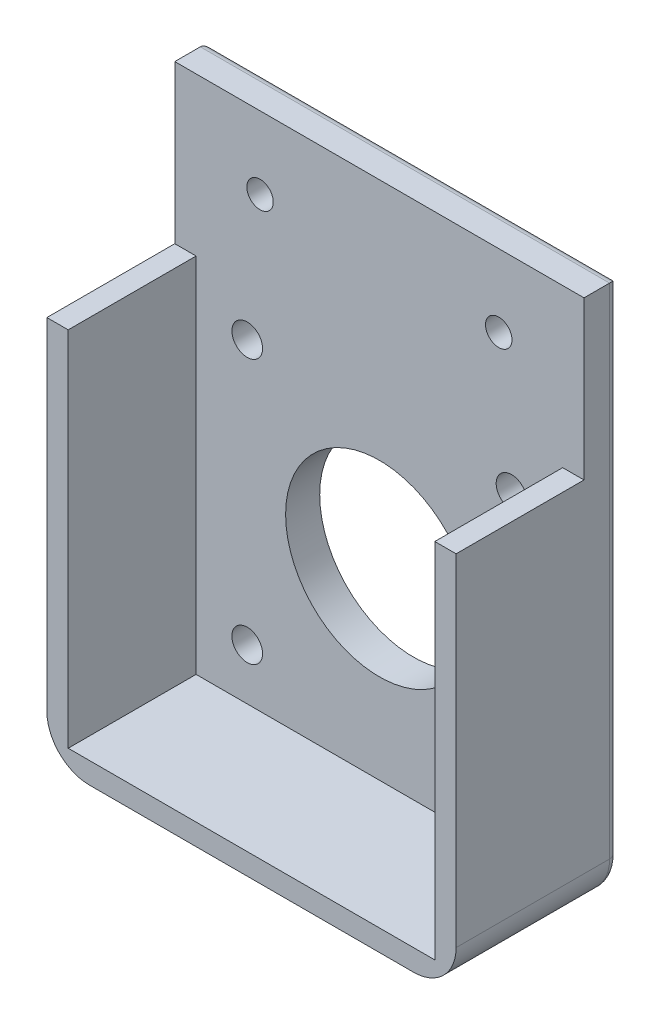
ISO-10303-21;
HEADER;
FILE_DESCRIPTION(('STEP AP214'),'2;1');
FILE_NAME('part.step','',(''),(''),'','','');
FILE_SCHEMA(('AUTOMOTIVE_DESIGN { 1 0 10303 214 1 1 1 1 }'));
ENDSEC;
DATA;
#1=APPLICATION_CONTEXT('core data for automotive mechanical design processes');
#2=APPLICATION_PROTOCOL_DEFINITION('international standard','automotive_design',2000,#1);
#3=PRODUCT_CONTEXT('',#1,'mechanical');
#4=PRODUCT('Part','Part','',(#3));
#5=PRODUCT_RELATED_PRODUCT_CATEGORY('part','',(#4));
#6=PRODUCT_DEFINITION_FORMATION('','',#4);
#7=PRODUCT_DEFINITION_CONTEXT('part definition',#1,'design');
#8=PRODUCT_DEFINITION('design','',#6,#7);
#9=PRODUCT_DEFINITION_SHAPE('','',#8);
#10=(LENGTH_UNIT() NAMED_UNIT(*) SI_UNIT(.MILLI.,.METRE.));
#11=(NAMED_UNIT(*) PLANE_ANGLE_UNIT() SI_UNIT($,.RADIAN.));
#12=(NAMED_UNIT(*) SI_UNIT($,.STERADIAN.) SOLID_ANGLE_UNIT());
#13=UNCERTAINTY_MEASURE_WITH_UNIT(LENGTH_MEASURE(1.E-05),#10,'distance_accuracy_value','');
#14=(GEOMETRIC_REPRESENTATION_CONTEXT(3) GLOBAL_UNCERTAINTY_ASSIGNED_CONTEXT((#13)) GLOBAL_UNIT_ASSIGNED_CONTEXT((#10,
#11,#12)) REPRESENTATION_CONTEXT('',''));
#15=CARTESIAN_POINT('',(0.,0.,0.));
#16=DIRECTION('',(0.,0.,1.));
#17=DIRECTION('',(1.,0.,0.));
#18=AXIS2_PLACEMENT_3D('',#15,#16,#17);
#19=CARTESIAN_POINT('',(0.,0.,0.));
#20=DIRECTION('',(0.,0.,1.));
#21=DIRECTION('',(1.,0.,0.));
#22=AXIS2_PLACEMENT_3D('',#19,#20,#21);
#23=PLANE('',#22);
#24=CARTESIAN_POINT('',(-4.35440613026818,60.4741379310345,0.));
#25=DIRECTION('',(0.,0.,1.));
#26=DIRECTION('',(1.,0.,0.));
#27=AXIS2_PLACEMENT_3D('',#24,#25,#26);
#28=CIRCLE('',#27,1.54999999999999);
#29=CARTESIAN_POINT('',(-2.80440613026819,60.4741379310345,0.));
#30=VERTEX_POINT('',#29);
#31=EDGE_CURVE('E221',#30,#30,#28,.T.);
#32=ORIENTED_EDGE('',*,*,#31,.T.);
#33=EDGE_LOOP('',(#32));
#34=FACE_BOUND('',#33,.T.);
#35=CARTESIAN_POINT('',(23.6455938697318,60.4741379310345,0.));
#36=DIRECTION('',(0.,0.,1.));
#37=DIRECTION('',(1.,0.,0.));
#38=AXIS2_PLACEMENT_3D('',#35,#36,#37);
#39=CIRCLE('',#38,1.54999999999999);
#40=CARTESIAN_POINT('',(25.1955938697318,60.4741379310345,0.));
#41=VERTEX_POINT('',#40);
#42=EDGE_CURVE('E227',#41,#41,#39,.T.);
#43=ORIENTED_EDGE('',*,*,#42,.T.);
#44=EDGE_LOOP('',(#43));
#45=FACE_BOUND('',#44,.T.);
#46=CARTESIAN_POINT('',(25.1455938697318,13.9741379310345,0.));
#47=DIRECTION('',(0.,0.,1.));
#48=DIRECTION('',(1.,0.,0.));
#49=AXIS2_PLACEMENT_3D('',#46,#47,#48);
#50=CIRCLE('',#49,1.8);
#51=CARTESIAN_POINT('',(26.9455938697318,13.9741379310345,0.));
#52=VERTEX_POINT('',#51);
#53=EDGE_CURVE('E233',#52,#52,#50,.T.);
#54=ORIENTED_EDGE('',*,*,#53,.T.);
#55=EDGE_LOOP('',(#54));
#56=FACE_BOUND('',#55,.T.);
#57=CARTESIAN_POINT('',(-5.85440613026818,13.9741379310345,0.));
#58=DIRECTION('',(0.,0.,1.));
#59=DIRECTION('',(1.,0.,0.));
#60=AXIS2_PLACEMENT_3D('',#57,#58,#59);
#61=CIRCLE('',#60,1.8);
#62=CARTESIAN_POINT('',(-4.05440613026818,13.9741379310345,0.));
#63=VERTEX_POINT('',#62);
#64=EDGE_CURVE('E239',#63,#63,#61,.T.);
#65=ORIENTED_EDGE('',*,*,#64,.T.);
#66=EDGE_LOOP('',(#65));
#67=FACE_BOUND('',#66,.T.);
#68=CARTESIAN_POINT('',(25.1455938697318,44.9741379310345,0.));
#69=DIRECTION('',(0.,0.,1.));
#70=DIRECTION('',(1.,0.,0.));
#71=AXIS2_PLACEMENT_3D('',#68,#69,#70);
#72=CIRCLE('',#71,1.8);
#73=CARTESIAN_POINT('',(26.9455938697318,44.9741379310345,0.));
#74=VERTEX_POINT('',#73);
#75=EDGE_CURVE('E242',#74,#74,#72,.T.);
#76=ORIENTED_EDGE('',*,*,#75,.T.);
#77=EDGE_LOOP('',(#76));
#78=FACE_BOUND('',#77,.T.);
#79=CARTESIAN_POINT('',(-5.85440613026818,44.9741379310345,0.));
#80=DIRECTION('',(0.,0.,1.));
#81=DIRECTION('',(1.,0.,0.));
#82=AXIS2_PLACEMENT_3D('',#79,#80,#81);
#83=CIRCLE('',#82,1.8);
#84=CARTESIAN_POINT('',(-4.05440613026818,44.9741379310345,0.));
#85=VERTEX_POINT('',#84);
#86=EDGE_CURVE('E251',#85,#85,#83,.T.);
#87=ORIENTED_EDGE('',*,*,#86,.T.);
#88=EDGE_LOOP('',(#87));
#89=FACE_BOUND('',#88,.T.);
#90=CARTESIAN_POINT('',(9.64559386973182,29.4741379310345,0.));
#91=DIRECTION('',(0.,0.,1.));
#92=DIRECTION('',(1.,0.,0.));
#93=AXIS2_PLACEMENT_3D('',#90,#91,#92);
#94=CIRCLE('',#93,11.);
#95=CARTESIAN_POINT('',(20.6455938697318,29.4741379310345,0.));
#96=VERTEX_POINT('',#95);
#97=EDGE_CURVE('E257',#96,#96,#94,.T.);
#98=ORIENTED_EDGE('',*,*,#97,.T.);
#99=EDGE_LOOP('',(#98));
#100=FACE_BOUND('',#99,.T.);
#101=CARTESIAN_POINT('',(-9.35440613026818,10.4741379310345,0.));
#102=DIRECTION('',(0.,0.,1.));
#103=DIRECTION('',(1.,0.,0.));
#104=AXIS2_PLACEMENT_3D('',#101,#102,#103);
#105=CIRCLE('',#104,4.);
#106=CARTESIAN_POINT('',(-13.3544061302682,10.4741379310345,0.));
#107=VERTEX_POINT('',#106);
#108=CARTESIAN_POINT('',(-9.35440613026818,6.47413793103448,0.));
#109=VERTEX_POINT('',#108);
#110=EDGE_CURVE('E297',#107,#109,#105,.T.);
#111=ORIENTED_EDGE('',*,*,#110,.F.);
#112=DIRECTION('',(0.,-1.,0.));
#113=VECTOR('',#112,1.);
#114=CARTESIAN_POINT('',(-13.3544061302682,0.,0.));
#115=LINE('',#114,#113);
#116=CARTESIAN_POINT('',(-13.3544061302682,67.9741379310345,0.));
#117=VERTEX_POINT('',#116);
#118=EDGE_CURVE('E280',#107,#117,#115,.F.);
#119=ORIENTED_EDGE('',*,*,#118,.T.);
#120=DIRECTION('',(-1.,0.,0.));
#121=VECTOR('',#120,1.);
#122=CARTESIAN_POINT('',(0.,67.9741379310345,0.));
#123=LINE('',#122,#121);
#124=CARTESIAN_POINT('',(32.6455938697318,67.9741379310345,0.));
#125=VERTEX_POINT('',#124);
#126=EDGE_CURVE('E275',#117,#125,#123,.F.);
#127=ORIENTED_EDGE('',*,*,#126,.T.);
#128=DIRECTION('',(0.,1.,0.));
#129=VECTOR('',#128,1.);
#130=CARTESIAN_POINT('',(32.6455938697318,0.,0.));
#131=LINE('',#130,#129);
#132=CARTESIAN_POINT('',(32.6455938697318,10.4741379310345,0.));
#133=VERTEX_POINT('',#132);
#134=EDGE_CURVE('E277',#125,#133,#131,.F.);
#135=ORIENTED_EDGE('',*,*,#134,.T.);
#136=CARTESIAN_POINT('',(28.6455938697318,10.4741379310345,0.));
#137=DIRECTION('',(0.,0.,1.));
#138=DIRECTION('',(1.,0.,0.));
#139=AXIS2_PLACEMENT_3D('',#136,#137,#138);
#140=CIRCLE('',#139,4.);
#141=CARTESIAN_POINT('',(28.6455938697318,6.47413793103448,0.));
#142=VERTEX_POINT('',#141);
#143=EDGE_CURVE('E291',#142,#133,#140,.T.);
#144=ORIENTED_EDGE('',*,*,#143,.F.);
#145=DIRECTION('',(1.,0.,0.));
#146=VECTOR('',#145,1.);
#147=CARTESIAN_POINT('',(0.,6.47413793103448,0.));
#148=LINE('',#147,#146);
#149=EDGE_CURVE('E282',#142,#109,#148,.F.);
#150=ORIENTED_EDGE('',*,*,#149,.T.);
#151=EDGE_LOOP('',(#111,#119,#127,#135,#144,#150));
#152=FACE_BOUND('',#151,.T.);
#153=ADVANCED_FACE('F43',(#34,#45,#56,#67,#78,#89,#100,#152),#23,.F.);
#154=CARTESIAN_POINT('',(0.,0.,4.));
#155=DIRECTION('',(0.,0.,1.));
#156=DIRECTION('',(1.,0.,0.));
#157=AXIS2_PLACEMENT_3D('',#154,#155,#156);
#158=PLANE('',#157);
#159=CARTESIAN_POINT('',(-4.35440613026818,60.4741379310345,4.));
#160=DIRECTION('',(0.,0.,1.));
#161=DIRECTION('',(1.,0.,0.));
#162=AXIS2_PLACEMENT_3D('',#159,#160,#161);
#163=CIRCLE('',#162,1.54999999999999);
#164=CARTESIAN_POINT('',(-2.80440613026819,60.4741379310345,4.));
#165=VERTEX_POINT('',#164);
#166=EDGE_CURVE('E173',#165,#165,#163,.T.);
#167=ORIENTED_EDGE('',*,*,#166,.F.);
#168=EDGE_LOOP('',(#167));
#169=FACE_BOUND('',#168,.T.);
#170=CARTESIAN_POINT('',(23.6455938697318,60.4741379310345,4.));
#171=DIRECTION('',(0.,0.,1.));
#172=DIRECTION('',(1.,0.,0.));
#173=AXIS2_PLACEMENT_3D('',#170,#171,#172);
#174=CIRCLE('',#173,1.54999999999999);
#175=CARTESIAN_POINT('',(25.1955938697318,60.4741379310345,4.));
#176=VERTEX_POINT('',#175);
#177=EDGE_CURVE('E224',#176,#176,#174,.T.);
#178=ORIENTED_EDGE('',*,*,#177,.F.);
#179=EDGE_LOOP('',(#178));
#180=FACE_BOUND('',#179,.T.);
#181=CARTESIAN_POINT('',(25.1455938697318,13.9741379310345,4.));
#182=DIRECTION('',(0.,0.,1.));
#183=DIRECTION('',(1.,0.,0.));
#184=AXIS2_PLACEMENT_3D('',#181,#182,#183);
#185=CIRCLE('',#184,1.8);
#186=CARTESIAN_POINT('',(26.9455938697318,13.9741379310345,4.));
#187=VERTEX_POINT('',#186);
#188=EDGE_CURVE('E230',#187,#187,#185,.T.);
#189=ORIENTED_EDGE('',*,*,#188,.F.);
#190=EDGE_LOOP('',(#189));
#191=FACE_BOUND('',#190,.T.);
#192=CARTESIAN_POINT('',(-5.85440613026818,13.9741379310345,4.));
#193=DIRECTION('',(0.,0.,1.));
#194=DIRECTION('',(1.,0.,0.));
#195=AXIS2_PLACEMENT_3D('',#192,#193,#194);
#196=CIRCLE('',#195,1.8);
#197=CARTESIAN_POINT('',(-4.05440613026818,13.9741379310345,4.));
#198=VERTEX_POINT('',#197);
#199=EDGE_CURVE('E236',#198,#198,#196,.T.);
#200=ORIENTED_EDGE('',*,*,#199,.F.);
#201=EDGE_LOOP('',(#200));
#202=FACE_BOUND('',#201,.T.);
#203=CARTESIAN_POINT('',(25.1455938697318,44.9741379310345,4.));
#204=DIRECTION('',(0.,0.,1.));
#205=DIRECTION('',(1.,0.,0.));
#206=AXIS2_PLACEMENT_3D('',#203,#204,#205);
#207=CIRCLE('',#206,1.8);
#208=CARTESIAN_POINT('',(26.9455938697318,44.9741379310345,4.));
#209=VERTEX_POINT('',#208);
#210=EDGE_CURVE('E245',#209,#209,#207,.T.);
#211=ORIENTED_EDGE('',*,*,#210,.F.);
#212=EDGE_LOOP('',(#211));
#213=FACE_BOUND('',#212,.T.);
#214=CARTESIAN_POINT('',(-5.85440613026818,44.9741379310345,4.));
#215=DIRECTION('',(0.,0.,1.));
#216=DIRECTION('',(1.,0.,0.));
#217=AXIS2_PLACEMENT_3D('',#214,#215,#216);
#218=CIRCLE('',#217,1.8);
#219=CARTESIAN_POINT('',(-4.05440613026818,44.9741379310345,4.));
#220=VERTEX_POINT('',#219);
#221=EDGE_CURVE('E248',#220,#220,#218,.T.);
#222=ORIENTED_EDGE('',*,*,#221,.F.);
#223=EDGE_LOOP('',(#222));
#224=FACE_BOUND('',#223,.T.);
#225=CARTESIAN_POINT('',(9.64559386973182,29.4741379310345,4.));
#226=DIRECTION('',(0.,0.,1.));
#227=DIRECTION('',(1.,0.,0.));
#228=AXIS2_PLACEMENT_3D('',#225,#226,#227);
#229=CIRCLE('',#228,11.);
#230=CARTESIAN_POINT('',(20.6455938697318,29.4741379310345,4.));
#231=VERTEX_POINT('',#230);
#232=EDGE_CURVE('E254',#231,#231,#229,.T.);
#233=ORIENTED_EDGE('',*,*,#232,.F.);
#234=EDGE_LOOP('',(#233));
#235=FACE_BOUND('',#234,.T.);
#236=DIRECTION('',(0.,-1.,0.));
#237=VECTOR('',#236,1.);
#238=CARTESIAN_POINT('',(-14.3544061302682,68.9741379310345,4.));
#239=LINE('',#238,#237);
#240=CARTESIAN_POINT('',(-14.3544061302682,68.9741379310345,4.));
#241=VERTEX_POINT('',#240);
#242=CARTESIAN_POINT('',(-14.3544061302682,50.4741379310345,4.));
#243=VERTEX_POINT('',#242);
#244=EDGE_CURVE('E261',#241,#243,#239,.T.);
#245=ORIENTED_EDGE('',*,*,#244,.T.);
#246=DIRECTION('',(1.,0.,0.));
#247=VECTOR('',#246,1.);
#248=CARTESIAN_POINT('',(0.,50.4741379310345,4.));
#249=LINE('',#248,#247);
#250=CARTESIAN_POINT('',(-11.8544061302682,50.4741379310345,4.));
#251=VERTEX_POINT('',#250);
#252=EDGE_CURVE('E205',#243,#251,#249,.T.);
#253=ORIENTED_EDGE('',*,*,#252,.T.);
#254=DIRECTION('',(0.,1.,0.));
#255=VECTOR('',#254,1.);
#256=CARTESIAN_POINT('',(-11.8544061302682,0.,4.));
#257=LINE('',#256,#255);
#258=CARTESIAN_POINT('',(-11.8544061302682,7.97413793103447,4.));
#259=VERTEX_POINT('',#258);
#260=EDGE_CURVE('E202',#259,#251,#257,.T.);
#261=ORIENTED_EDGE('',*,*,#260,.F.);
#262=DIRECTION('',(1.,0.,0.));
#263=VECTOR('',#262,1.);
#264=CARTESIAN_POINT('',(0.,7.97413793103447,4.));
#265=LINE('',#264,#263);
#266=CARTESIAN_POINT('',(31.1455938697318,7.97413793103447,4.));
#267=VERTEX_POINT('',#266);
#268=EDGE_CURVE('E200',#259,#267,#265,.T.);
#269=ORIENTED_EDGE('',*,*,#268,.T.);
#270=DIRECTION('',(0.,1.,0.));
#271=VECTOR('',#270,1.);
#272=CARTESIAN_POINT('',(31.1455938697318,0.,4.));
#273=LINE('',#272,#271);
#274=CARTESIAN_POINT('',(31.1455938697318,50.4741379310345,4.));
#275=VERTEX_POINT('',#274);
#276=EDGE_CURVE('E197',#267,#275,#273,.T.);
#277=ORIENTED_EDGE('',*,*,#276,.T.);
#278=DIRECTION('',(-1.,0.,0.));
#279=VECTOR('',#278,1.);
#280=CARTESIAN_POINT('',(0.,50.4741379310345,4.));
#281=LINE('',#280,#279);
#282=CARTESIAN_POINT('',(33.6455938697318,50.4741379310345,4.));
#283=VERTEX_POINT('',#282);
#284=EDGE_CURVE('E195',#283,#275,#281,.T.);
#285=ORIENTED_EDGE('',*,*,#284,.F.);
#286=DIRECTION('',(0.,1.,0.));
#287=VECTOR('',#286,1.);
#288=CARTESIAN_POINT('',(33.6455938697318,68.9741379310345,4.));
#289=LINE('',#288,#287);
#290=CARTESIAN_POINT('',(33.6455938697318,68.9741379310345,4.));
#291=VERTEX_POINT('',#290);
#292=EDGE_CURVE('E170',#283,#291,#289,.T.);
#293=ORIENTED_EDGE('',*,*,#292,.T.);
#294=DIRECTION('',(-1.,0.,0.));
#295=VECTOR('',#294,1.);
#296=CARTESIAN_POINT('',(-14.3544061302682,68.9741379310345,4.));
#297=LINE('',#296,#295);
#298=EDGE_CURVE('E265',#291,#241,#297,.T.);
#299=ORIENTED_EDGE('',*,*,#298,.T.);
#300=EDGE_LOOP('',(#245,#253,#261,#269,#277,#285,#293,#299));
#301=FACE_BOUND('',#300,.T.);
#302=ADVANCED_FACE('F346',(#169,#180,#191,#202,#213,#224,#235,#301),#158,.T.);
#303=CARTESIAN_POINT('',(-14.3544061302682,68.9741379310345,4.));
#304=DIRECTION('',(1.,0.,0.));
#305=DIRECTION('',(0.,0.,-1.));
#306=AXIS2_PLACEMENT_3D('',#303,#304,#305);
#307=PLANE('',#306);
#308=DIRECTION('',(0.,-1.,0.));
#309=VECTOR('',#308,1.);
#310=CARTESIAN_POINT('',(-14.3544061302682,68.9741379310345,1.));
#311=LINE('',#310,#309);
#312=CARTESIAN_POINT('',(-14.3544061302682,68.9741379310345,1.));
#313=VERTEX_POINT('',#312);
#314=CARTESIAN_POINT('',(-14.3544061302682,10.4741379310345,1.));
#315=VERTEX_POINT('',#314);
#316=EDGE_CURVE('E285',#313,#315,#311,.T.);
#317=ORIENTED_EDGE('',*,*,#316,.T.);
#318=DIRECTION('',(0.,0.,-1.));
#319=VECTOR('',#318,1.);
#320=CARTESIAN_POINT('',(-14.3544061302682,10.4741379310345,4.));
#321=LINE('',#320,#319);
#322=CARTESIAN_POINT('',(-14.3544061302682,10.4741379310345,19.));
#323=VERTEX_POINT('',#322);
#324=EDGE_CURVE('E11',#315,#323,#321,.F.);
#325=ORIENTED_EDGE('',*,*,#324,.T.);
#326=DIRECTION('',(0.,-1.,0.));
#327=VECTOR('',#326,1.);
#328=CARTESIAN_POINT('',(-14.3544061302682,0.,19.));
#329=LINE('',#328,#327);
#330=CARTESIAN_POINT('',(-14.3544061302682,50.4741379310345,19.));
#331=VERTEX_POINT('',#330);
#332=EDGE_CURVE('E192',#331,#323,#329,.T.);
#333=ORIENTED_EDGE('',*,*,#332,.F.);
#334=DIRECTION('',(0.,0.,-1.));
#335=VECTOR('',#334,1.);
#336=CARTESIAN_POINT('',(-14.3544061302682,50.4741379310345,19.));
#337=LINE('',#336,#335);
#338=EDGE_CURVE('E194',#331,#243,#337,.T.);
#339=ORIENTED_EDGE('',*,*,#338,.T.);
#340=ORIENTED_EDGE('',*,*,#244,.F.);
#341=DIRECTION('',(0.,0.,-1.));
#342=VECTOR('',#341,1.);
#343=CARTESIAN_POINT('',(-14.3544061302682,68.9741379310345,4.));
#344=LINE('',#343,#342);
#345=EDGE_CURVE('E267',#241,#313,#344,.T.);
#346=ORIENTED_EDGE('',*,*,#345,.T.);
#347=EDGE_LOOP('',(#317,#325,#333,#339,#340,#346));
#348=FACE_BOUND('',#347,.T.);
#349=ADVANCED_FACE('F343',(#348),#307,.F.);
#350=CARTESIAN_POINT('',(-14.3544061302682,5.47413793103448,4.));
#351=DIRECTION('',(0.,1.,0.));
#352=DIRECTION('',(0.,0.,1.));
#353=AXIS2_PLACEMENT_3D('',#350,#351,#352);
#354=PLANE('',#353);
#355=DIRECTION('',(1.,0.,0.));
#356=VECTOR('',#355,1.);
#357=CARTESIAN_POINT('',(-14.3544061302682,5.47413793103448,1.));
#358=LINE('',#357,#356);
#359=CARTESIAN_POINT('',(-9.35440613026818,5.47413793103448,1.));
#360=VERTEX_POINT('',#359);
#361=CARTESIAN_POINT('',(28.6455938697318,5.47413793103448,1.));
#362=VERTEX_POINT('',#361);
#363=EDGE_CURVE('E273',#360,#362,#358,.T.);
#364=ORIENTED_EDGE('',*,*,#363,.T.);
#365=DIRECTION('',(0.,0.,-1.));
#366=VECTOR('',#365,1.);
#367=CARTESIAN_POINT('',(28.6455938697318,5.47413793103448,4.));
#368=LINE('',#367,#366);
#369=CARTESIAN_POINT('',(28.6455938697318,5.47413793103448,19.));
#370=VERTEX_POINT('',#369);
#371=EDGE_CURVE('E66',#362,#370,#368,.F.);
#372=ORIENTED_EDGE('',*,*,#371,.T.);
#373=DIRECTION('',(1.,0.,0.));
#374=VECTOR('',#373,1.);
#375=CARTESIAN_POINT('',(0.,5.47413793103448,19.));
#376=LINE('',#375,#374);
#377=CARTESIAN_POINT('',(-9.35440613026818,5.47413793103448,19.));
#378=VERTEX_POINT('',#377);
#379=EDGE_CURVE('E163',#378,#370,#376,.T.);
#380=ORIENTED_EDGE('',*,*,#379,.F.);
#381=DIRECTION('',(0.,0.,-1.));
#382=VECTOR('',#381,1.);
#383=CARTESIAN_POINT('',(-9.35440613026818,5.47413793103448,4.));
#384=LINE('',#383,#382);
#385=EDGE_CURVE('E311',#378,#360,#384,.T.);
#386=ORIENTED_EDGE('',*,*,#385,.T.);
#387=EDGE_LOOP('',(#364,#372,#380,#386));
#388=FACE_BOUND('',#387,.T.);
#389=ADVANCED_FACE('F386',(#388),#354,.F.);
#390=CARTESIAN_POINT('',(33.6455938697318,68.9741379310345,4.));
#391=DIRECTION('',(-1.,0.,0.));
#392=DIRECTION('',(0.,-1.,0.));
#393=AXIS2_PLACEMENT_3D('',#390,#391,#392);
#394=PLANE('',#393);
#395=DIRECTION('',(0.,1.,0.));
#396=VECTOR('',#395,1.);
#397=CARTESIAN_POINT('',(33.6455938697318,0.,19.));
#398=LINE('',#397,#396);
#399=CARTESIAN_POINT('',(33.6455938697318,10.4741379310345,19.));
#400=VERTEX_POINT('',#399);
#401=CARTESIAN_POINT('',(33.6455938697318,50.4741379310345,19.));
#402=VERTEX_POINT('',#401);
#403=EDGE_CURVE('E153',#400,#402,#398,.T.);
#404=ORIENTED_EDGE('',*,*,#403,.F.);
#405=DIRECTION('',(0.,0.,-1.));
#406=VECTOR('',#405,1.);
#407=CARTESIAN_POINT('',(33.6455938697318,10.4741379310345,4.));
#408=LINE('',#407,#406);
#409=CARTESIAN_POINT('',(33.6455938697318,10.4741379310345,1.));
#410=VERTEX_POINT('',#409);
#411=EDGE_CURVE('E309',#400,#410,#408,.T.);
#412=ORIENTED_EDGE('',*,*,#411,.T.);
#413=DIRECTION('',(0.,1.,0.));
#414=VECTOR('',#413,1.);
#415=CARTESIAN_POINT('',(33.6455938697318,68.9741379310345,1.));
#416=LINE('',#415,#414);
#417=CARTESIAN_POINT('',(33.6455938697318,68.9741379310345,1.));
#418=VERTEX_POINT('',#417);
#419=EDGE_CURVE('E287',#410,#418,#416,.T.);
#420=ORIENTED_EDGE('',*,*,#419,.T.);
#421=DIRECTION('',(0.,0.,-1.));
#422=VECTOR('',#421,1.);
#423=CARTESIAN_POINT('',(33.6455938697318,68.9741379310345,4.));
#424=LINE('',#423,#422);
#425=EDGE_CURVE('E270',#291,#418,#424,.T.);
#426=ORIENTED_EDGE('',*,*,#425,.F.);
#427=ORIENTED_EDGE('',*,*,#292,.F.);
#428=DIRECTION('',(0.,0.,-1.));
#429=VECTOR('',#428,1.);
#430=CARTESIAN_POINT('',(33.6455938697318,50.4741379310345,19.));
#431=LINE('',#430,#429);
#432=EDGE_CURVE('E167',#402,#283,#431,.T.);
#433=ORIENTED_EDGE('',*,*,#432,.F.);
#434=EDGE_LOOP('',(#404,#412,#420,#426,#427,#433));
#435=FACE_BOUND('',#434,.T.);
#436=ADVANCED_FACE('F168',(#435),#394,.F.);
#437=CARTESIAN_POINT('',(-14.3544061302682,68.9741379310345,4.));
#438=DIRECTION('',(0.,-1.,0.));
#439=DIRECTION('',(0.,0.,-1.));
#440=AXIS2_PLACEMENT_3D('',#437,#438,#439);
#441=PLANE('',#440);
#442=ORIENTED_EDGE('',*,*,#425,.T.);
#443=DIRECTION('',(-1.,0.,0.));
#444=VECTOR('',#443,1.);
#445=CARTESIAN_POINT('',(-14.3544061302682,68.9741379310345,1.));
#446=LINE('',#445,#444);
#447=EDGE_CURVE('E289',#418,#313,#446,.T.);
#448=ORIENTED_EDGE('',*,*,#447,.T.);
#449=ORIENTED_EDGE('',*,*,#345,.F.);
#450=ORIENTED_EDGE('',*,*,#298,.F.);
#451=EDGE_LOOP('',(#442,#448,#449,#450));
#452=FACE_BOUND('',#451,.T.);
#453=ADVANCED_FACE('F340',(#452),#441,.F.);
#454=CARTESIAN_POINT('',(-14.3544061302682,67.9741379310345,1.));
#455=DIRECTION('',(-1.,0.,0.));
#456=DIRECTION('',(0.,0.,1.));
#457=AXIS2_PLACEMENT_3D('',#454,#455,#456);
#458=CYLINDRICAL_SURFACE('',#457,1.);
#459=CARTESIAN_POINT('',(32.6455938697318,67.9741379310345,1.));
#460=DIRECTION('',(-0.707106781186547,0.707106781186547,0.));
#461=DIRECTION('',(-0.707106781186547,-0.707106781186548,0.));
#462=AXIS2_PLACEMENT_3D('',#459,#460,#461);
#463=ELLIPSE('',#462,1.41421356237309,1.);
#464=EDGE_CURVE('E260',#125,#418,#463,.F.);
#465=ORIENTED_EDGE('',*,*,#464,.F.);
#466=ORIENTED_EDGE('',*,*,#126,.F.);
#467=CARTESIAN_POINT('',(-13.3544061302682,67.9741379310345,1.));
#468=DIRECTION('',(-0.707106781186547,-0.707106781186547,0.));
#469=DIRECTION('',(-0.707106781186547,0.707106781186547,0.));
#470=AXIS2_PLACEMENT_3D('',#467,#468,#469);
#471=ELLIPSE('',#470,1.41421356237309,1.);
#472=EDGE_CURVE('E263',#313,#117,#471,.T.);
#473=ORIENTED_EDGE('',*,*,#472,.F.);
#474=ORIENTED_EDGE('',*,*,#447,.F.);
#475=EDGE_LOOP('',(#465,#466,#473,#474));
#476=FACE_BOUND('',#475,.T.);
#477=ADVANCED_FACE('F335',(#476),#458,.T.);
#478=CARTESIAN_POINT('',(-13.3544061302682,68.9741379310345,1.));
#479=DIRECTION('',(0.,-1.,0.));
#480=DIRECTION('',(0.,0.,-1.));
#481=AXIS2_PLACEMENT_3D('',#478,#479,#480);
#482=CYLINDRICAL_SURFACE('',#481,1.);
#483=ORIENTED_EDGE('',*,*,#118,.F.);
#484=CARTESIAN_POINT('',(-13.3544061302682,10.4741379310345,1.));
#485=DIRECTION('',(0.,1.,0.));
#486=DIRECTION('',(0.,0.,1.));
#487=AXIS2_PLACEMENT_3D('',#484,#485,#486);
#488=CIRCLE('',#487,1.);
#489=EDGE_CURVE('E307',#107,#315,#488,.T.);
#490=ORIENTED_EDGE('',*,*,#489,.T.);
#491=ORIENTED_EDGE('',*,*,#316,.F.);
#492=ORIENTED_EDGE('',*,*,#472,.T.);
#493=EDGE_LOOP('',(#483,#490,#491,#492));
#494=FACE_BOUND('',#493,.T.);
#495=ADVANCED_FACE('F398',(#494),#482,.T.);
#496=CARTESIAN_POINT('',(32.6455938697318,68.9741379310345,1.));
#497=DIRECTION('',(0.,1.,0.));
#498=DIRECTION('',(-1.,0.,0.));
#499=AXIS2_PLACEMENT_3D('',#496,#497,#498);
#500=CYLINDRICAL_SURFACE('',#499,1.);
#501=ORIENTED_EDGE('',*,*,#419,.F.);
#502=CARTESIAN_POINT('',(32.6455938697318,10.4741379310345,1.));
#503=DIRECTION('',(0.,1.,0.));
#504=DIRECTION('',(0.,0.,1.));
#505=AXIS2_PLACEMENT_3D('',#502,#503,#504);
#506=CIRCLE('',#505,1.);
#507=EDGE_CURVE('E304',#410,#133,#506,.T.);
#508=ORIENTED_EDGE('',*,*,#507,.T.);
#509=ORIENTED_EDGE('',*,*,#134,.F.);
#510=ORIENTED_EDGE('',*,*,#464,.T.);
#511=EDGE_LOOP('',(#501,#508,#509,#510));
#512=FACE_BOUND('',#511,.T.);
#513=ADVANCED_FACE('F329',(#512),#500,.T.);
#514=CARTESIAN_POINT('',(-14.3544061302682,6.47413793103448,1.));
#515=DIRECTION('',(1.,0.,0.));
#516=DIRECTION('',(0.,0.,-1.));
#517=AXIS2_PLACEMENT_3D('',#514,#515,#516);
#518=CYLINDRICAL_SURFACE('',#517,1.);
#519=ORIENTED_EDGE('',*,*,#363,.F.);
#520=CARTESIAN_POINT('',(-9.35440613026818,6.47413793103448,1.));
#521=DIRECTION('',(1.,0.,0.));
#522=DIRECTION('',(0.,0.,-1.));
#523=AXIS2_PLACEMENT_3D('',#520,#521,#522);
#524=CIRCLE('',#523,1.);
#525=EDGE_CURVE('E302',#360,#109,#524,.T.);
#526=ORIENTED_EDGE('',*,*,#525,.T.);
#527=ORIENTED_EDGE('',*,*,#149,.F.);
#528=CARTESIAN_POINT('',(28.6455938697318,6.47413793103448,1.));
#529=DIRECTION('',(-1.,0.,0.));
#530=DIRECTION('',(0.,0.,1.));
#531=AXIS2_PLACEMENT_3D('',#528,#529,#530);
#532=CIRCLE('',#531,1.);
#533=EDGE_CURVE('E300',#142,#362,#532,.T.);
#534=ORIENTED_EDGE('',*,*,#533,.T.);
#535=EDGE_LOOP('',(#519,#526,#527,#534));
#536=FACE_BOUND('',#535,.T.);
#537=ADVANCED_FACE('F391',(#536),#518,.T.);
#538=CARTESIAN_POINT('',(9.64559386973182,29.4741379310345,4.));
#539=DIRECTION('',(0.,0.,1.));
#540=DIRECTION('',(1.,0.,0.));
#541=AXIS2_PLACEMENT_3D('',#538,#539,#540);
#542=CYLINDRICAL_SURFACE('',#541,11.);
#543=ORIENTED_EDGE('',*,*,#97,.F.);
#544=EDGE_LOOP('',(#543));
#545=FACE_BOUND('',#544,.T.);
#546=ORIENTED_EDGE('',*,*,#232,.T.);
#547=EDGE_LOOP('',(#546));
#548=FACE_BOUND('',#547,.T.);
#549=ADVANCED_FACE('F394',(#545,#548),#542,.F.);
#550=CARTESIAN_POINT('',(-5.85440613026818,44.9741379310345,4.));
#551=DIRECTION('',(0.,0.,1.));
#552=DIRECTION('',(1.,0.,0.));
#553=AXIS2_PLACEMENT_3D('',#550,#551,#552);
#554=CYLINDRICAL_SURFACE('',#553,1.8);
#555=ORIENTED_EDGE('',*,*,#86,.F.);
#556=EDGE_LOOP('',(#555));
#557=FACE_BOUND('',#556,.T.);
#558=ORIENTED_EDGE('',*,*,#221,.T.);
#559=EDGE_LOOP('',(#558));
#560=FACE_BOUND('',#559,.T.);
#561=ADVANCED_FACE('F514',(#557,#560),#554,.F.);
#562=CARTESIAN_POINT('',(25.1455938697318,44.9741379310345,4.));
#563=DIRECTION('',(0.,0.,1.));
#564=DIRECTION('',(1.,0.,0.));
#565=AXIS2_PLACEMENT_3D('',#562,#563,#564);
#566=CYLINDRICAL_SURFACE('',#565,1.8);
#567=ORIENTED_EDGE('',*,*,#75,.F.);
#568=EDGE_LOOP('',(#567));
#569=FACE_BOUND('',#568,.T.);
#570=ORIENTED_EDGE('',*,*,#210,.T.);
#571=EDGE_LOOP('',(#570));
#572=FACE_BOUND('',#571,.T.);
#573=ADVANCED_FACE('F504',(#569,#572),#566,.F.);
#574=CARTESIAN_POINT('',(-5.85440613026818,13.9741379310345,4.));
#575=DIRECTION('',(0.,0.,1.));
#576=DIRECTION('',(1.,0.,0.));
#577=AXIS2_PLACEMENT_3D('',#574,#575,#576);
#578=CYLINDRICAL_SURFACE('',#577,1.8);
#579=ORIENTED_EDGE('',*,*,#64,.F.);
#580=EDGE_LOOP('',(#579));
#581=FACE_BOUND('',#580,.T.);
#582=ORIENTED_EDGE('',*,*,#199,.T.);
#583=EDGE_LOOP('',(#582));
#584=FACE_BOUND('',#583,.T.);
#585=ADVANCED_FACE('F494',(#581,#584),#578,.F.);
#586=CARTESIAN_POINT('',(25.1455938697318,13.9741379310345,4.));
#587=DIRECTION('',(0.,0.,1.));
#588=DIRECTION('',(1.,0.,0.));
#589=AXIS2_PLACEMENT_3D('',#586,#587,#588);
#590=CYLINDRICAL_SURFACE('',#589,1.8);
#591=ORIENTED_EDGE('',*,*,#53,.F.);
#592=EDGE_LOOP('',(#591));
#593=FACE_BOUND('',#592,.T.);
#594=ORIENTED_EDGE('',*,*,#188,.T.);
#595=EDGE_LOOP('',(#594));
#596=FACE_BOUND('',#595,.T.);
#597=ADVANCED_FACE('F484',(#593,#596),#590,.F.);
#598=CARTESIAN_POINT('',(23.6455938697318,60.4741379310345,4.));
#599=DIRECTION('',(0.,0.,1.));
#600=DIRECTION('',(1.,0.,0.));
#601=AXIS2_PLACEMENT_3D('',#598,#599,#600);
#602=CYLINDRICAL_SURFACE('',#601,1.54999999999999);
#603=ORIENTED_EDGE('',*,*,#42,.F.);
#604=EDGE_LOOP('',(#603));
#605=FACE_BOUND('',#604,.T.);
#606=ORIENTED_EDGE('',*,*,#177,.T.);
#607=EDGE_LOOP('',(#606));
#608=FACE_BOUND('',#607,.T.);
#609=ADVANCED_FACE('F474',(#605,#608),#602,.F.);
#610=CARTESIAN_POINT('',(-4.35440613026818,60.4741379310345,4.));
#611=DIRECTION('',(0.,0.,1.));
#612=DIRECTION('',(1.,0.,0.));
#613=AXIS2_PLACEMENT_3D('',#610,#611,#612);
#614=CYLINDRICAL_SURFACE('',#613,1.54999999999999);
#615=ORIENTED_EDGE('',*,*,#31,.F.);
#616=EDGE_LOOP('',(#615));
#617=FACE_BOUND('',#616,.T.);
#618=ORIENTED_EDGE('',*,*,#166,.T.);
#619=EDGE_LOOP('',(#618));
#620=FACE_BOUND('',#619,.T.);
#621=ADVANCED_FACE('F464',(#617,#620),#614,.F.);
#622=CARTESIAN_POINT('',(0.,50.4741379310345,19.));
#623=DIRECTION('',(0.,-1.,0.));
#624=DIRECTION('',(0.,0.,-1.));
#625=AXIS2_PLACEMENT_3D('',#622,#623,#624);
#626=PLANE('',#625);
#627=ORIENTED_EDGE('',*,*,#284,.T.);
#628=DIRECTION('',(0.,0.,-1.));
#629=VECTOR('',#628,1.);
#630=CARTESIAN_POINT('',(31.1455938697318,50.4741379310345,19.));
#631=LINE('',#630,#629);
#632=CARTESIAN_POINT('',(31.1455938697318,50.4741379310345,19.));
#633=VERTEX_POINT('',#632);
#634=EDGE_CURVE('E174',#633,#275,#631,.T.);
#635=ORIENTED_EDGE('',*,*,#634,.F.);
#636=DIRECTION('',(-1.,0.,0.));
#637=VECTOR('',#636,1.);
#638=CARTESIAN_POINT('',(0.,50.4741379310345,19.));
#639=LINE('',#638,#637);
#640=EDGE_CURVE('E158',#402,#633,#639,.T.);
#641=ORIENTED_EDGE('',*,*,#640,.F.);
#642=ORIENTED_EDGE('',*,*,#432,.T.);
#643=EDGE_LOOP('',(#627,#635,#641,#642));
#644=FACE_BOUND('',#643,.T.);
#645=ADVANCED_FACE('F176',(#644),#626,.F.);
#646=CARTESIAN_POINT('',(31.1455938697318,0.,19.));
#647=DIRECTION('',(-1.,0.,0.));
#648=DIRECTION('',(0.,0.,1.));
#649=AXIS2_PLACEMENT_3D('',#646,#647,#648);
#650=PLANE('',#649);
#651=ORIENTED_EDGE('',*,*,#276,.F.);
#652=DIRECTION('',(0.,0.,-1.));
#653=VECTOR('',#652,1.);
#654=CARTESIAN_POINT('',(31.1455938697318,7.97413793103447,19.));
#655=LINE('',#654,#653);
#656=CARTESIAN_POINT('',(31.1455938697318,7.97413793103447,19.));
#657=VERTEX_POINT('',#656);
#658=EDGE_CURVE('E215',#657,#267,#655,.T.);
#659=ORIENTED_EDGE('',*,*,#658,.F.);
#660=DIRECTION('',(0.,1.,0.));
#661=VECTOR('',#660,1.);
#662=CARTESIAN_POINT('',(31.1455938697318,0.,19.));
#663=LINE('',#662,#661);
#664=EDGE_CURVE('E179',#657,#633,#663,.T.);
#665=ORIENTED_EDGE('',*,*,#664,.T.);
#666=ORIENTED_EDGE('',*,*,#634,.T.);
#667=EDGE_LOOP('',(#651,#659,#665,#666));
#668=FACE_BOUND('',#667,.T.);
#669=ADVANCED_FACE('F350',(#668),#650,.T.);
#670=CARTESIAN_POINT('',(0.,7.97413793103447,19.));
#671=DIRECTION('',(0.,1.,0.));
#672=DIRECTION('',(0.,0.,1.));
#673=AXIS2_PLACEMENT_3D('',#670,#671,#672);
#674=PLANE('',#673);
#675=ORIENTED_EDGE('',*,*,#268,.F.);
#676=DIRECTION('',(0.,0.,-1.));
#677=VECTOR('',#676,1.);
#678=CARTESIAN_POINT('',(-11.8544061302682,7.97413793103447,19.));
#679=LINE('',#678,#677);
#680=CARTESIAN_POINT('',(-11.8544061302682,7.97413793103447,19.));
#681=VERTEX_POINT('',#680);
#682=EDGE_CURVE('E212',#681,#259,#679,.T.);
#683=ORIENTED_EDGE('',*,*,#682,.F.);
#684=DIRECTION('',(1.,0.,0.));
#685=VECTOR('',#684,1.);
#686=CARTESIAN_POINT('',(0.,7.97413793103447,19.));
#687=LINE('',#686,#685);
#688=EDGE_CURVE('E181',#681,#657,#687,.T.);
#689=ORIENTED_EDGE('',*,*,#688,.T.);
#690=ORIENTED_EDGE('',*,*,#658,.T.);
#691=EDGE_LOOP('',(#675,#683,#689,#690));
#692=FACE_BOUND('',#691,.T.);
#693=ADVANCED_FACE('F353',(#692),#674,.T.);
#694=CARTESIAN_POINT('',(-11.8544061302682,0.,19.));
#695=DIRECTION('',(-1.,0.,0.));
#696=DIRECTION('',(0.,0.,1.));
#697=AXIS2_PLACEMENT_3D('',#694,#695,#696);
#698=PLANE('',#697);
#699=ORIENTED_EDGE('',*,*,#260,.T.);
#700=DIRECTION('',(0.,0.,-1.));
#701=VECTOR('',#700,1.);
#702=CARTESIAN_POINT('',(-11.8544061302682,50.4741379310345,19.));
#703=LINE('',#702,#701);
#704=CARTESIAN_POINT('',(-11.8544061302682,50.4741379310345,19.));
#705=VERTEX_POINT('',#704);
#706=EDGE_CURVE('E209',#705,#251,#703,.T.);
#707=ORIENTED_EDGE('',*,*,#706,.F.);
#708=DIRECTION('',(0.,1.,0.));
#709=VECTOR('',#708,1.);
#710=CARTESIAN_POINT('',(-11.8544061302682,0.,19.));
#711=LINE('',#710,#709);
#712=EDGE_CURVE('E187',#681,#705,#711,.T.);
#713=ORIENTED_EDGE('',*,*,#712,.F.);
#714=ORIENTED_EDGE('',*,*,#682,.T.);
#715=EDGE_LOOP('',(#699,#707,#713,#714));
#716=FACE_BOUND('',#715,.T.);
#717=ADVANCED_FACE('F357',(#716),#698,.F.);
#718=CARTESIAN_POINT('',(0.,50.4741379310345,19.));
#719=DIRECTION('',(0.,1.,0.));
#720=DIRECTION('',(0.,0.,1.));
#721=AXIS2_PLACEMENT_3D('',#718,#719,#720);
#722=PLANE('',#721);
#723=ORIENTED_EDGE('',*,*,#252,.F.);
#724=ORIENTED_EDGE('',*,*,#338,.F.);
#725=DIRECTION('',(1.,0.,0.));
#726=VECTOR('',#725,1.);
#727=CARTESIAN_POINT('',(0.,50.4741379310345,19.));
#728=LINE('',#727,#726);
#729=EDGE_CURVE('E189',#331,#705,#728,.T.);
#730=ORIENTED_EDGE('',*,*,#729,.T.);
#731=ORIENTED_EDGE('',*,*,#706,.T.);
#732=EDGE_LOOP('',(#723,#724,#730,#731));
#733=FACE_BOUND('',#732,.T.);
#734=ADVANCED_FACE('F361',(#733),#722,.T.);
#735=CARTESIAN_POINT('',(0.,0.,19.));
#736=DIRECTION('',(0.,0.,1.));
#737=DIRECTION('',(1.,0.,0.));
#738=AXIS2_PLACEMENT_3D('',#735,#736,#737);
#739=PLANE('',#738);
#740=ORIENTED_EDGE('',*,*,#379,.T.);
#741=CARTESIAN_POINT('',(28.6455938697318,10.4741379310345,19.));
#742=DIRECTION('',(0.,0.,1.));
#743=DIRECTION('',(1.,0.,0.));
#744=AXIS2_PLACEMENT_3D('',#741,#742,#743);
#745=CIRCLE('',#744,5.);
#746=EDGE_CURVE('E52',#370,#400,#745,.T.);
#747=ORIENTED_EDGE('',*,*,#746,.T.);
#748=ORIENTED_EDGE('',*,*,#403,.T.);
#749=ORIENTED_EDGE('',*,*,#640,.T.);
#750=ORIENTED_EDGE('',*,*,#664,.F.);
#751=ORIENTED_EDGE('',*,*,#688,.F.);
#752=ORIENTED_EDGE('',*,*,#712,.T.);
#753=ORIENTED_EDGE('',*,*,#729,.F.);
#754=ORIENTED_EDGE('',*,*,#332,.T.);
#755=CARTESIAN_POINT('',(-9.35440613026818,10.4741379310345,19.));
#756=DIRECTION('',(0.,0.,1.));
#757=DIRECTION('',(1.,0.,0.));
#758=AXIS2_PLACEMENT_3D('',#755,#756,#757);
#759=CIRCLE('',#758,5.);
#760=EDGE_CURVE('E314',#323,#378,#759,.T.);
#761=ORIENTED_EDGE('',*,*,#760,.T.);
#762=EDGE_LOOP('',(#740,#747,#748,#749,#750,#751,#752,#753,#754,#761));
#763=FACE_BOUND('',#762,.T.);
#764=ADVANCED_FACE('F155',(#763),#739,.T.);
#765=CARTESIAN_POINT('',(-9.35440613026818,10.4741379310345,4.));
#766=DIRECTION('',(0.,0.,-1.));
#767=DIRECTION('',(-1.,0.,0.));
#768=AXIS2_PLACEMENT_3D('',#765,#766,#767);
#769=CYLINDRICAL_SURFACE('',#768,5.);
#770=ORIENTED_EDGE('',*,*,#760,.F.);
#771=ORIENTED_EDGE('',*,*,#324,.F.);
#772=CARTESIAN_POINT('',(-9.35440613026818,10.4741379310345,1.));
#773=DIRECTION('',(0.,0.,1.));
#774=DIRECTION('',(1.,0.,0.));
#775=AXIS2_PLACEMENT_3D('',#772,#773,#774);
#776=CIRCLE('',#775,5.);
#777=EDGE_CURVE('E198',#360,#315,#776,.F.);
#778=ORIENTED_EDGE('',*,*,#777,.F.);
#779=ORIENTED_EDGE('',*,*,#385,.F.);
#780=EDGE_LOOP('',(#770,#771,#778,#779));
#781=FACE_BOUND('',#780,.T.);
#782=ADVANCED_FACE('F368',(#781),#769,.T.);
#783=CARTESIAN_POINT('',(-9.35440613026818,10.4741379310345,1.));
#784=DIRECTION('',(0.,0.,1.));
#785=DIRECTION('',(1.,0.,0.));
#786=AXIS2_PLACEMENT_3D('',#783,#784,#785);
#787=TOROIDAL_SURFACE('',#786,4.,1.);
#788=ORIENTED_EDGE('',*,*,#489,.F.);
#789=ORIENTED_EDGE('',*,*,#110,.T.);
#790=ORIENTED_EDGE('',*,*,#525,.F.);
#791=ORIENTED_EDGE('',*,*,#777,.T.);
#792=EDGE_LOOP('',(#788,#789,#790,#791));
#793=FACE_BOUND('',#792,.T.);
#794=ADVANCED_FACE('F404',(#793),#787,.T.);
#795=CARTESIAN_POINT('',(28.6455938697318,10.4741379310345,4.));
#796=DIRECTION('',(0.,0.,-1.));
#797=DIRECTION('',(-1.,0.,0.));
#798=AXIS2_PLACEMENT_3D('',#795,#796,#797);
#799=CYLINDRICAL_SURFACE('',#798,5.);
#800=ORIENTED_EDGE('',*,*,#746,.F.);
#801=ORIENTED_EDGE('',*,*,#371,.F.);
#802=CARTESIAN_POINT('',(28.6455938697318,10.4741379310345,1.));
#803=DIRECTION('',(0.,0.,1.));
#804=DIRECTION('',(1.,0.,0.));
#805=AXIS2_PLACEMENT_3D('',#802,#803,#804);
#806=CIRCLE('',#805,5.);
#807=EDGE_CURVE('E47',#410,#362,#806,.F.);
#808=ORIENTED_EDGE('',*,*,#807,.F.);
#809=ORIENTED_EDGE('',*,*,#411,.F.);
#810=EDGE_LOOP('',(#800,#801,#808,#809));
#811=FACE_BOUND('',#810,.T.);
#812=ADVANCED_FACE('F45',(#811),#799,.T.);
#813=CARTESIAN_POINT('',(28.6455938697318,10.4741379310345,1.));
#814=DIRECTION('',(0.,0.,1.));
#815=DIRECTION('',(1.,0.,0.));
#816=AXIS2_PLACEMENT_3D('',#813,#814,#815);
#817=TOROIDAL_SURFACE('',#816,4.,1.);
#818=ORIENTED_EDGE('',*,*,#507,.F.);
#819=ORIENTED_EDGE('',*,*,#807,.T.);
#820=ORIENTED_EDGE('',*,*,#533,.F.);
#821=ORIENTED_EDGE('',*,*,#143,.T.);
#822=EDGE_LOOP('',(#818,#819,#820,#821));
#823=FACE_BOUND('',#822,.T.);
#824=ADVANCED_FACE('F325',(#823),#817,.T.);
#825=CLOSED_SHELL('',(#153,#302,#349,#389,#436,#453,#477,#495,#513,#537,#549,#561,#573,#585,
#597,#609,#621,#645,#669,#693,#717,#734,#764,#782,#794,#812,#824));
#826=MANIFOLD_SOLID_BREP('B2',#825);
#827=ADVANCED_BREP_SHAPE_REPRESENTATION('',(#18,#826),#14);
#828=SHAPE_DEFINITION_REPRESENTATION(#9,#827);
ENDSEC;
END-ISO-10303-21;
